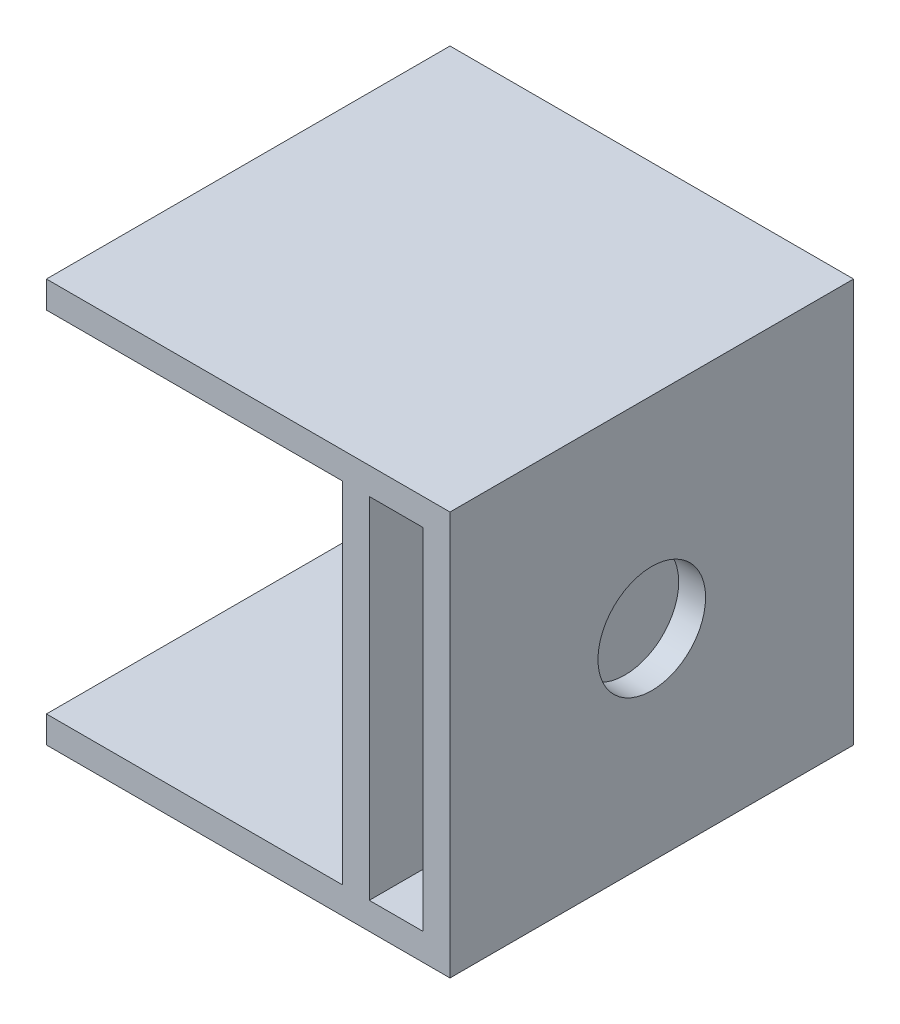
ISO-10303-21;
HEADER;
FILE_DESCRIPTION(('STEP AP214'),'2;1');
FILE_NAME('part.step','',(''),(''),'','','');
FILE_SCHEMA(('AUTOMOTIVE_DESIGN { 1 0 10303 214 1 1 1 1 }'));
ENDSEC;
DATA;
#1=APPLICATION_CONTEXT('core data for automotive mechanical design processes');
#2=APPLICATION_PROTOCOL_DEFINITION('international standard','automotive_design',2000,#1);
#3=PRODUCT_CONTEXT('',#1,'mechanical');
#4=PRODUCT('Part','Part','',(#3));
#5=PRODUCT_RELATED_PRODUCT_CATEGORY('part','',(#4));
#6=PRODUCT_DEFINITION_FORMATION('','',#4);
#7=PRODUCT_DEFINITION_CONTEXT('part definition',#1,'design');
#8=PRODUCT_DEFINITION('design','',#6,#7);
#9=PRODUCT_DEFINITION_SHAPE('','',#8);
#10=(LENGTH_UNIT() NAMED_UNIT(*) SI_UNIT(.MILLI.,.METRE.));
#11=(NAMED_UNIT(*) PLANE_ANGLE_UNIT() SI_UNIT($,.RADIAN.));
#12=(NAMED_UNIT(*) SI_UNIT($,.STERADIAN.) SOLID_ANGLE_UNIT());
#13=UNCERTAINTY_MEASURE_WITH_UNIT(LENGTH_MEASURE(1.E-05),#10,'distance_accuracy_value','');
#14=(GEOMETRIC_REPRESENTATION_CONTEXT(3) GLOBAL_UNCERTAINTY_ASSIGNED_CONTEXT((#13)) GLOBAL_UNIT_ASSIGNED_CONTEXT((#10,
#11,#12)) REPRESENTATION_CONTEXT('',''));
#15=CARTESIAN_POINT('',(0.,0.,0.));
#16=DIRECTION('',(0.,0.,1.));
#17=DIRECTION('',(1.,0.,0.));
#18=AXIS2_PLACEMENT_3D('',#15,#16,#17);
#19=CARTESIAN_POINT('',(0.,0.,30.));
#20=DIRECTION('',(0.,0.,1.));
#21=DIRECTION('',(1.,0.,0.));
#22=AXIS2_PLACEMENT_3D('',#19,#20,#21);
#23=PLANE('',#22);
#24=DIRECTION('',(0.,-1.,0.));
#25=VECTOR('',#24,1.);
#26=CARTESIAN_POINT('',(-17.8612716763006,18.2225433526011,30.));
#27=LINE('',#26,#25);
#28=CARTESIAN_POINT('',(-17.8612716763006,18.2225433526011,30.));
#29=VERTEX_POINT('',#28);
#30=CARTESIAN_POINT('',(-17.8612716763006,16.2225433526011,30.));
#31=VERTEX_POINT('',#30);
#32=EDGE_CURVE('E161',#29,#31,#27,.T.);
#33=ORIENTED_EDGE('',*,*,#32,.T.);
#34=DIRECTION('',(1.,0.,0.));
#35=VECTOR('',#34,1.);
#36=CARTESIAN_POINT('',(-17.8612716763006,16.2225433526011,30.));
#37=LINE('',#36,#35);
#38=CARTESIAN_POINT('',(4.13872832369941,16.2225433526011,30.));
#39=VERTEX_POINT('',#38);
#40=EDGE_CURVE('E164',#31,#39,#37,.T.);
#41=ORIENTED_EDGE('',*,*,#40,.T.);
#42=DIRECTION('',(0.,-1.,0.));
#43=VECTOR('',#42,1.);
#44=CARTESIAN_POINT('',(4.13872832369941,16.2225433526011,30.));
#45=LINE('',#44,#43);
#46=CARTESIAN_POINT('',(4.13872832369941,-9.77745664739885,30.));
#47=VERTEX_POINT('',#46);
#48=EDGE_CURVE('E167',#39,#47,#45,.T.);
#49=ORIENTED_EDGE('',*,*,#48,.T.);
#50=DIRECTION('',(-1.,0.,0.));
#51=VECTOR('',#50,1.);
#52=CARTESIAN_POINT('',(4.13872832369941,-9.77745664739885,30.));
#53=LINE('',#52,#51);
#54=CARTESIAN_POINT('',(-17.8612716763006,-9.77745664739885,30.));
#55=VERTEX_POINT('',#54);
#56=EDGE_CURVE('E169',#47,#55,#53,.T.);
#57=ORIENTED_EDGE('',*,*,#56,.T.);
#58=DIRECTION('',(0.,-1.,0.));
#59=VECTOR('',#58,1.);
#60=CARTESIAN_POINT('',(-17.8612716763006,-9.77745664739885,30.));
#61=LINE('',#60,#59);
#62=CARTESIAN_POINT('',(-17.8612716763006,-11.7774566473989,30.));
#63=VERTEX_POINT('',#62);
#64=EDGE_CURVE('E171',#55,#63,#61,.T.);
#65=ORIENTED_EDGE('',*,*,#64,.T.);
#66=DIRECTION('',(1.,0.,0.));
#67=VECTOR('',#66,1.);
#68=CARTESIAN_POINT('',(12.1387283236994,-11.7774566473989,30.));
#69=LINE('',#68,#67);
#70=CARTESIAN_POINT('',(12.1387283236994,-11.7774566473989,30.));
#71=VERTEX_POINT('',#70);
#72=EDGE_CURVE('E173',#63,#71,#69,.T.);
#73=ORIENTED_EDGE('',*,*,#72,.T.);
#74=DIRECTION('',(0.,1.,0.));
#75=VECTOR('',#74,1.);
#76=CARTESIAN_POINT('',(12.1387283236994,18.2225433526011,30.));
#77=LINE('',#76,#75);
#78=CARTESIAN_POINT('',(12.1387283236994,18.2225433526011,30.));
#79=VERTEX_POINT('',#78);
#80=EDGE_CURVE('E175',#71,#79,#77,.T.);
#81=ORIENTED_EDGE('',*,*,#80,.T.);
#82=DIRECTION('',(-1.,0.,0.));
#83=VECTOR('',#82,1.);
#84=CARTESIAN_POINT('',(-17.8612716763006,18.2225433526011,30.));
#85=LINE('',#84,#83);
#86=EDGE_CURVE('E177',#79,#29,#85,.T.);
#87=ORIENTED_EDGE('',*,*,#86,.T.);
#88=EDGE_LOOP('',(#33,#41,#49,#57,#65,#73,#81,#87));
#89=FACE_BOUND('',#88,.T.);
#90=DIRECTION('',(0.,-1.,0.));
#91=VECTOR('',#90,1.);
#92=CARTESIAN_POINT('',(6.13872832369941,16.2225433526011,30.));
#93=LINE('',#92,#91);
#94=CARTESIAN_POINT('',(6.13872832369941,16.2225433526011,30.));
#95=VERTEX_POINT('',#94);
#96=CARTESIAN_POINT('',(6.13872832369941,-9.77745664739885,30.));
#97=VERTEX_POINT('',#96);
#98=EDGE_CURVE('E131',#95,#97,#93,.T.);
#99=ORIENTED_EDGE('',*,*,#98,.F.);
#100=DIRECTION('',(-1.,0.,0.));
#101=VECTOR('',#100,1.);
#102=CARTESIAN_POINT('',(6.13872832369941,16.2225433526011,30.));
#103=LINE('',#102,#101);
#104=CARTESIAN_POINT('',(10.1387283236994,16.2225433526011,30.));
#105=VERTEX_POINT('',#104);
#106=EDGE_CURVE('E123',#105,#95,#103,.T.);
#107=ORIENTED_EDGE('',*,*,#106,.F.);
#108=DIRECTION('',(0.,1.,0.));
#109=VECTOR('',#108,1.);
#110=CARTESIAN_POINT('',(10.1387283236994,16.2225433526011,30.));
#111=LINE('',#110,#109);
#112=CARTESIAN_POINT('',(10.1387283236994,-9.77745664739885,30.));
#113=VERTEX_POINT('',#112);
#114=EDGE_CURVE('E145',#113,#105,#111,.T.);
#115=ORIENTED_EDGE('',*,*,#114,.F.);
#116=DIRECTION('',(1.,0.,0.));
#117=VECTOR('',#116,1.);
#118=CARTESIAN_POINT('',(10.1387283236994,-9.77745664739885,30.));
#119=LINE('',#118,#117);
#120=EDGE_CURVE('E143',#97,#113,#119,.T.);
#121=ORIENTED_EDGE('',*,*,#120,.F.);
#122=EDGE_LOOP('',(#99,#107,#115,#121));
#123=FACE_BOUND('',#122,.T.);
#124=ADVANCED_FACE('F33',(#89,#123),#23,.T.);
#125=CARTESIAN_POINT('',(0.,0.,0.));
#126=DIRECTION('',(0.,0.,1.));
#127=DIRECTION('',(1.,0.,0.));
#128=AXIS2_PLACEMENT_3D('',#125,#126,#127);
#129=PLANE('',#128);
#130=DIRECTION('',(0.,-1.,0.));
#131=VECTOR('',#130,1.);
#132=CARTESIAN_POINT('',(-17.8612716763006,18.2225433526011,0.));
#133=LINE('',#132,#131);
#134=CARTESIAN_POINT('',(-17.8612716763006,18.2225433526011,0.));
#135=VERTEX_POINT('',#134);
#136=CARTESIAN_POINT('',(-17.8612716763006,16.2225433526011,0.));
#137=VERTEX_POINT('',#136);
#138=EDGE_CURVE('E139',#135,#137,#133,.T.);
#139=ORIENTED_EDGE('',*,*,#138,.F.);
#140=DIRECTION('',(-1.,0.,0.));
#141=VECTOR('',#140,1.);
#142=CARTESIAN_POINT('',(-17.8612716763006,18.2225433526011,0.));
#143=LINE('',#142,#141);
#144=CARTESIAN_POINT('',(12.1387283236994,18.2225433526011,0.));
#145=VERTEX_POINT('',#144);
#146=EDGE_CURVE('E165',#145,#135,#143,.T.);
#147=ORIENTED_EDGE('',*,*,#146,.F.);
#148=DIRECTION('',(0.,1.,0.));
#149=VECTOR('',#148,1.);
#150=CARTESIAN_POINT('',(12.1387283236994,18.2225433526011,0.));
#151=LINE('',#150,#149);
#152=CARTESIAN_POINT('',(12.1387283236994,-11.7774566473989,0.));
#153=VERTEX_POINT('',#152);
#154=EDGE_CURVE('E192',#153,#145,#151,.T.);
#155=ORIENTED_EDGE('',*,*,#154,.F.);
#156=DIRECTION('',(1.,0.,0.));
#157=VECTOR('',#156,1.);
#158=CARTESIAN_POINT('',(12.1387283236994,-11.7774566473989,0.));
#159=LINE('',#158,#157);
#160=CARTESIAN_POINT('',(-17.8612716763006,-11.7774566473989,0.));
#161=VERTEX_POINT('',#160);
#162=EDGE_CURVE('E190',#161,#153,#159,.T.);
#163=ORIENTED_EDGE('',*,*,#162,.F.);
#164=DIRECTION('',(0.,-1.,0.));
#165=VECTOR('',#164,1.);
#166=CARTESIAN_POINT('',(-17.8612716763006,-9.77745664739885,0.));
#167=LINE('',#166,#165);
#168=CARTESIAN_POINT('',(-17.8612716763006,-9.77745664739885,0.));
#169=VERTEX_POINT('',#168);
#170=EDGE_CURVE('E188',#169,#161,#167,.T.);
#171=ORIENTED_EDGE('',*,*,#170,.F.);
#172=DIRECTION('',(-1.,0.,0.));
#173=VECTOR('',#172,1.);
#174=CARTESIAN_POINT('',(4.13872832369941,-9.77745664739885,0.));
#175=LINE('',#174,#173);
#176=CARTESIAN_POINT('',(4.13872832369941,-9.77745664739885,0.));
#177=VERTEX_POINT('',#176);
#178=EDGE_CURVE('E186',#177,#169,#175,.T.);
#179=ORIENTED_EDGE('',*,*,#178,.F.);
#180=DIRECTION('',(0.,-1.,0.));
#181=VECTOR('',#180,1.);
#182=CARTESIAN_POINT('',(4.13872832369941,16.2225433526011,0.));
#183=LINE('',#182,#181);
#184=CARTESIAN_POINT('',(4.13872832369941,16.2225433526011,0.));
#185=VERTEX_POINT('',#184);
#186=EDGE_CURVE('E184',#185,#177,#183,.T.);
#187=ORIENTED_EDGE('',*,*,#186,.F.);
#188=DIRECTION('',(1.,0.,0.));
#189=VECTOR('',#188,1.);
#190=CARTESIAN_POINT('',(-17.8612716763006,16.2225433526011,0.));
#191=LINE('',#190,#189);
#192=EDGE_CURVE('E182',#137,#185,#191,.T.);
#193=ORIENTED_EDGE('',*,*,#192,.F.);
#194=EDGE_LOOP('',(#139,#147,#155,#163,#171,#179,#187,#193));
#195=FACE_BOUND('',#194,.T.);
#196=DIRECTION('',(-1.,0.,0.));
#197=VECTOR('',#196,1.);
#198=CARTESIAN_POINT('',(6.13872832369941,16.2225433526011,0.));
#199=LINE('',#198,#197);
#200=CARTESIAN_POINT('',(10.1387283236994,16.2225433526011,0.));
#201=VERTEX_POINT('',#200);
#202=CARTESIAN_POINT('',(6.13872832369941,16.2225433526011,0.));
#203=VERTEX_POINT('',#202);
#204=EDGE_CURVE('E57',#201,#203,#199,.T.);
#205=ORIENTED_EDGE('',*,*,#204,.T.);
#206=DIRECTION('',(0.,-1.,0.));
#207=VECTOR('',#206,1.);
#208=CARTESIAN_POINT('',(6.13872832369941,16.2225433526011,0.));
#209=LINE('',#208,#207);
#210=CARTESIAN_POINT('',(6.13872832369941,-9.77745664739885,0.));
#211=VERTEX_POINT('',#210);
#212=EDGE_CURVE('E138',#203,#211,#209,.T.);
#213=ORIENTED_EDGE('',*,*,#212,.T.);
#214=DIRECTION('',(1.,0.,0.));
#215=VECTOR('',#214,1.);
#216=CARTESIAN_POINT('',(10.1387283236994,-9.77745664739885,0.));
#217=LINE('',#216,#215);
#218=CARTESIAN_POINT('',(10.1387283236994,-9.77745664739885,0.));
#219=VERTEX_POINT('',#218);
#220=EDGE_CURVE('E153',#211,#219,#217,.T.);
#221=ORIENTED_EDGE('',*,*,#220,.T.);
#222=DIRECTION('',(0.,1.,0.));
#223=VECTOR('',#222,1.);
#224=CARTESIAN_POINT('',(10.1387283236994,16.2225433526011,0.));
#225=LINE('',#224,#223);
#226=EDGE_CURVE('E132',#219,#201,#225,.T.);
#227=ORIENTED_EDGE('',*,*,#226,.T.);
#228=EDGE_LOOP('',(#205,#213,#221,#227));
#229=FACE_BOUND('',#228,.T.);
#230=ADVANCED_FACE('F223',(#195,#229),#129,.F.);
#231=CARTESIAN_POINT('',(-17.8612716763006,18.2225433526011,30.));
#232=DIRECTION('',(1.,0.,0.));
#233=DIRECTION('',(0.,0.,-1.));
#234=AXIS2_PLACEMENT_3D('',#231,#232,#233);
#235=PLANE('',#234);
#236=ORIENTED_EDGE('',*,*,#138,.T.);
#237=DIRECTION('',(0.,0.,-1.));
#238=VECTOR('',#237,1.);
#239=CARTESIAN_POINT('',(-17.8612716763006,16.2225433526011,30.));
#240=LINE('',#239,#238);
#241=EDGE_CURVE('E11',#31,#137,#240,.T.);
#242=ORIENTED_EDGE('',*,*,#241,.F.);
#243=ORIENTED_EDGE('',*,*,#32,.F.);
#244=DIRECTION('',(0.,0.,-1.));
#245=VECTOR('',#244,1.);
#246=CARTESIAN_POINT('',(-17.8612716763006,18.2225433526011,30.));
#247=LINE('',#246,#245);
#248=EDGE_CURVE('E179',#29,#135,#247,.T.);
#249=ORIENTED_EDGE('',*,*,#248,.T.);
#250=EDGE_LOOP('',(#236,#242,#243,#249));
#251=FACE_BOUND('',#250,.T.);
#252=ADVANCED_FACE('F35',(#251),#235,.F.);
#253=CARTESIAN_POINT('',(-17.8612716763006,16.2225433526011,30.));
#254=DIRECTION('',(0.,1.,0.));
#255=DIRECTION('',(0.,0.,1.));
#256=AXIS2_PLACEMENT_3D('',#253,#254,#255);
#257=PLANE('',#256);
#258=ORIENTED_EDGE('',*,*,#192,.T.);
#259=DIRECTION('',(0.,0.,-1.));
#260=VECTOR('',#259,1.);
#261=CARTESIAN_POINT('',(4.13872832369941,16.2225433526011,30.));
#262=LINE('',#261,#260);
#263=EDGE_CURVE('E42',#39,#185,#262,.T.);
#264=ORIENTED_EDGE('',*,*,#263,.F.);
#265=ORIENTED_EDGE('',*,*,#40,.F.);
#266=ORIENTED_EDGE('',*,*,#241,.T.);
#267=EDGE_LOOP('',(#258,#264,#265,#266));
#268=FACE_BOUND('',#267,.T.);
#269=ADVANCED_FACE('F240',(#268),#257,.F.);
#270=CARTESIAN_POINT('',(4.13872832369941,16.2225433526011,30.));
#271=DIRECTION('',(1.,0.,0.));
#272=DIRECTION('',(0.,1.,0.));
#273=AXIS2_PLACEMENT_3D('',#270,#271,#272);
#274=PLANE('',#273);
#275=CARTESIAN_POINT('',(4.13872832369941,3.22254335260115,15.));
#276=DIRECTION('',(1.,0.,0.));
#277=DIRECTION('',(0.,1.,0.));
#278=AXIS2_PLACEMENT_3D('',#275,#276,#277);
#279=CIRCLE('',#278,4.);
#280=CARTESIAN_POINT('',(4.13872832369941,7.22254335260115,15.));
#281=VERTEX_POINT('',#280);
#282=EDGE_CURVE('E151',#281,#281,#279,.T.);
#283=ORIENTED_EDGE('',*,*,#282,.T.);
#284=EDGE_LOOP('',(#283));
#285=FACE_BOUND('',#284,.T.);
#286=ORIENTED_EDGE('',*,*,#186,.T.);
#287=DIRECTION('',(0.,0.,-1.));
#288=VECTOR('',#287,1.);
#289=CARTESIAN_POINT('',(4.13872832369941,-9.77745664739885,30.));
#290=LINE('',#289,#288);
#291=EDGE_CURVE('E209',#47,#177,#290,.T.);
#292=ORIENTED_EDGE('',*,*,#291,.F.);
#293=ORIENTED_EDGE('',*,*,#48,.F.);
#294=ORIENTED_EDGE('',*,*,#263,.T.);
#295=EDGE_LOOP('',(#286,#292,#293,#294));
#296=FACE_BOUND('',#295,.T.);
#297=ADVANCED_FACE('F217',(#285,#296),#274,.F.);
#298=CARTESIAN_POINT('',(4.13872832369941,-9.77745664739885,30.));
#299=DIRECTION('',(0.,-1.,0.));
#300=DIRECTION('',(1.,0.,0.));
#301=AXIS2_PLACEMENT_3D('',#298,#299,#300);
#302=PLANE('',#301);
#303=ORIENTED_EDGE('',*,*,#178,.T.);
#304=DIRECTION('',(0.,0.,-1.));
#305=VECTOR('',#304,1.);
#306=CARTESIAN_POINT('',(-17.8612716763006,-9.77745664739885,30.));
#307=LINE('',#306,#305);
#308=EDGE_CURVE('E206',#55,#169,#307,.T.);
#309=ORIENTED_EDGE('',*,*,#308,.F.);
#310=ORIENTED_EDGE('',*,*,#56,.F.);
#311=ORIENTED_EDGE('',*,*,#291,.T.);
#312=EDGE_LOOP('',(#303,#309,#310,#311));
#313=FACE_BOUND('',#312,.T.);
#314=ADVANCED_FACE('F229',(#313),#302,.F.);
#315=CARTESIAN_POINT('',(-17.8612716763006,-9.77745664739885,30.));
#316=DIRECTION('',(1.,0.,0.));
#317=DIRECTION('',(0.,0.,-1.));
#318=AXIS2_PLACEMENT_3D('',#315,#316,#317);
#319=PLANE('',#318);
#320=ORIENTED_EDGE('',*,*,#170,.T.);
#321=DIRECTION('',(0.,0.,-1.));
#322=VECTOR('',#321,1.);
#323=CARTESIAN_POINT('',(-17.8612716763006,-11.7774566473989,30.));
#324=LINE('',#323,#322);
#325=EDGE_CURVE('E203',#63,#161,#324,.T.);
#326=ORIENTED_EDGE('',*,*,#325,.F.);
#327=ORIENTED_EDGE('',*,*,#64,.F.);
#328=ORIENTED_EDGE('',*,*,#308,.T.);
#329=EDGE_LOOP('',(#320,#326,#327,#328));
#330=FACE_BOUND('',#329,.T.);
#331=ADVANCED_FACE('F233',(#330),#319,.F.);
#332=CARTESIAN_POINT('',(12.1387283236994,-11.7774566473989,30.));
#333=DIRECTION('',(0.,1.,0.));
#334=DIRECTION('',(0.,0.,1.));
#335=AXIS2_PLACEMENT_3D('',#332,#333,#334);
#336=PLANE('',#335);
#337=ORIENTED_EDGE('',*,*,#162,.T.);
#338=DIRECTION('',(0.,0.,-1.));
#339=VECTOR('',#338,1.);
#340=CARTESIAN_POINT('',(12.1387283236994,-11.7774566473989,30.));
#341=LINE('',#340,#339);
#342=EDGE_CURVE('E200',#71,#153,#341,.T.);
#343=ORIENTED_EDGE('',*,*,#342,.F.);
#344=ORIENTED_EDGE('',*,*,#72,.F.);
#345=ORIENTED_EDGE('',*,*,#325,.T.);
#346=EDGE_LOOP('',(#337,#343,#344,#345));
#347=FACE_BOUND('',#346,.T.);
#348=ADVANCED_FACE('F253',(#347),#336,.F.);
#349=CARTESIAN_POINT('',(12.1387283236994,18.2225433526011,30.));
#350=DIRECTION('',(-1.,0.,0.));
#351=DIRECTION('',(0.,0.,1.));
#352=AXIS2_PLACEMENT_3D('',#349,#350,#351);
#353=PLANE('',#352);
#354=CARTESIAN_POINT('',(12.1387283236994,3.22254335260115,15.));
#355=DIRECTION('',(1.,0.,0.));
#356=DIRECTION('',(0.,0.,-1.));
#357=AXIS2_PLACEMENT_3D('',#354,#355,#356);
#358=CIRCLE('',#357,4.);
#359=CARTESIAN_POINT('',(12.1387283236994,3.22254335260115,11.));
#360=VERTEX_POINT('',#359);
#361=EDGE_CURVE('E305',#360,#360,#358,.T.);
#362=ORIENTED_EDGE('',*,*,#361,.F.);
#363=EDGE_LOOP('',(#362));
#364=FACE_BOUND('',#363,.T.);
#365=ORIENTED_EDGE('',*,*,#154,.T.);
#366=DIRECTION('',(0.,0.,-1.));
#367=VECTOR('',#366,1.);
#368=CARTESIAN_POINT('',(12.1387283236994,18.2225433526011,30.));
#369=LINE('',#368,#367);
#370=EDGE_CURVE('E197',#79,#145,#369,.T.);
#371=ORIENTED_EDGE('',*,*,#370,.F.);
#372=ORIENTED_EDGE('',*,*,#80,.F.);
#373=ORIENTED_EDGE('',*,*,#342,.T.);
#374=EDGE_LOOP('',(#365,#371,#372,#373));
#375=FACE_BOUND('',#374,.T.);
#376=ADVANCED_FACE('F251',(#364,#375),#353,.F.);
#377=CARTESIAN_POINT('',(-17.8612716763006,18.2225433526011,30.));
#378=DIRECTION('',(0.,-1.,0.));
#379=DIRECTION('',(0.,0.,-1.));
#380=AXIS2_PLACEMENT_3D('',#377,#378,#379);
#381=PLANE('',#380);
#382=ORIENTED_EDGE('',*,*,#146,.T.);
#383=ORIENTED_EDGE('',*,*,#248,.F.);
#384=ORIENTED_EDGE('',*,*,#86,.F.);
#385=ORIENTED_EDGE('',*,*,#370,.T.);
#386=EDGE_LOOP('',(#382,#383,#384,#385));
#387=FACE_BOUND('',#386,.T.);
#388=ADVANCED_FACE('F246',(#387),#381,.F.);
#389=CARTESIAN_POINT('',(6.13872832369941,16.2225433526011,30.));
#390=DIRECTION('',(0.,-1.,0.));
#391=DIRECTION('',(0.,0.,-1.));
#392=AXIS2_PLACEMENT_3D('',#389,#390,#391);
#393=PLANE('',#392);
#394=ORIENTED_EDGE('',*,*,#204,.F.);
#395=DIRECTION('',(0.,0.,-1.));
#396=VECTOR('',#395,1.);
#397=CARTESIAN_POINT('',(10.1387283236994,16.2225433526011,30.));
#398=LINE('',#397,#396);
#399=EDGE_CURVE('E127',#105,#201,#398,.T.);
#400=ORIENTED_EDGE('',*,*,#399,.F.);
#401=ORIENTED_EDGE('',*,*,#106,.T.);
#402=DIRECTION('',(0.,0.,-1.));
#403=VECTOR('',#402,1.);
#404=CARTESIAN_POINT('',(6.13872832369941,16.2225433526011,30.));
#405=LINE('',#404,#403);
#406=EDGE_CURVE('E126',#95,#203,#405,.T.);
#407=ORIENTED_EDGE('',*,*,#406,.T.);
#408=EDGE_LOOP('',(#394,#400,#401,#407));
#409=FACE_BOUND('',#408,.T.);
#410=ADVANCED_FACE('F125',(#409),#393,.T.);
#411=CARTESIAN_POINT('',(6.13872832369941,16.2225433526011,30.));
#412=DIRECTION('',(1.,0.,0.));
#413=DIRECTION('',(0.,1.,0.));
#414=AXIS2_PLACEMENT_3D('',#411,#412,#413);
#415=PLANE('',#414);
#416=CARTESIAN_POINT('',(6.13872832369941,3.22254335260115,15.));
#417=DIRECTION('',(1.,0.,0.));
#418=DIRECTION('',(0.,1.,0.));
#419=AXIS2_PLACEMENT_3D('',#416,#417,#418);
#420=CIRCLE('',#419,4.);
#421=CARTESIAN_POINT('',(6.13872832369941,7.22254335260115,15.));
#422=VERTEX_POINT('',#421);
#423=EDGE_CURVE('E307',#422,#422,#420,.T.);
#424=ORIENTED_EDGE('',*,*,#423,.F.);
#425=EDGE_LOOP('',(#424));
#426=FACE_BOUND('',#425,.T.);
#427=ORIENTED_EDGE('',*,*,#212,.F.);
#428=ORIENTED_EDGE('',*,*,#406,.F.);
#429=ORIENTED_EDGE('',*,*,#98,.T.);
#430=DIRECTION('',(0.,0.,-1.));
#431=VECTOR('',#430,1.);
#432=CARTESIAN_POINT('',(6.13872832369941,-9.77745664739885,30.));
#433=LINE('',#432,#431);
#434=EDGE_CURVE('E140',#97,#211,#433,.T.);
#435=ORIENTED_EDGE('',*,*,#434,.T.);
#436=EDGE_LOOP('',(#427,#428,#429,#435));
#437=FACE_BOUND('',#436,.T.);
#438=ADVANCED_FACE('F135',(#426,#437),#415,.T.);
#439=CARTESIAN_POINT('',(10.1387283236994,-9.77745664739885,30.));
#440=DIRECTION('',(0.,1.,0.));
#441=DIRECTION('',(0.,0.,1.));
#442=AXIS2_PLACEMENT_3D('',#439,#440,#441);
#443=PLANE('',#442);
#444=ORIENTED_EDGE('',*,*,#220,.F.);
#445=ORIENTED_EDGE('',*,*,#434,.F.);
#446=ORIENTED_EDGE('',*,*,#120,.T.);
#447=DIRECTION('',(0.,0.,-1.));
#448=VECTOR('',#447,1.);
#449=CARTESIAN_POINT('',(10.1387283236994,-9.77745664739885,30.));
#450=LINE('',#449,#448);
#451=EDGE_CURVE('E49',#113,#219,#450,.T.);
#452=ORIENTED_EDGE('',*,*,#451,.T.);
#453=EDGE_LOOP('',(#444,#445,#446,#452));
#454=FACE_BOUND('',#453,.T.);
#455=ADVANCED_FACE('F279',(#454),#443,.T.);
#456=CARTESIAN_POINT('',(10.1387283236994,16.2225433526011,30.));
#457=DIRECTION('',(-1.,0.,0.));
#458=DIRECTION('',(0.,-1.,0.));
#459=AXIS2_PLACEMENT_3D('',#456,#457,#458);
#460=PLANE('',#459);
#461=CARTESIAN_POINT('',(10.1387283236994,3.22254335260115,15.));
#462=DIRECTION('',(-1.,0.,0.));
#463=DIRECTION('',(0.,-1.,0.));
#464=AXIS2_PLACEMENT_3D('',#461,#462,#463);
#465=CIRCLE('',#464,4.);
#466=CARTESIAN_POINT('',(10.1387283236994,-0.777456647398852,15.));
#467=VERTEX_POINT('',#466);
#468=EDGE_CURVE('E37',#467,#467,#465,.T.);
#469=ORIENTED_EDGE('',*,*,#468,.F.);
#470=EDGE_LOOP('',(#469));
#471=FACE_BOUND('',#470,.T.);
#472=ORIENTED_EDGE('',*,*,#226,.F.);
#473=ORIENTED_EDGE('',*,*,#451,.F.);
#474=ORIENTED_EDGE('',*,*,#114,.T.);
#475=ORIENTED_EDGE('',*,*,#399,.T.);
#476=EDGE_LOOP('',(#472,#473,#474,#475));
#477=FACE_BOUND('',#476,.T.);
#478=ADVANCED_FACE('F284',(#471,#477),#460,.T.);
#479=CARTESIAN_POINT('',(-17.8612716763006,3.22254335260115,15.));
#480=DIRECTION('',(1.,0.,0.));
#481=DIRECTION('',(0.,0.,-1.));
#482=AXIS2_PLACEMENT_3D('',#479,#480,#481);
#483=CYLINDRICAL_SURFACE('',#482,4.);
#484=ORIENTED_EDGE('',*,*,#468,.T.);
#485=EDGE_LOOP('',(#484));
#486=FACE_BOUND('',#485,.T.);
#487=ORIENTED_EDGE('',*,*,#361,.T.);
#488=EDGE_LOOP('',(#487));
#489=FACE_BOUND('',#488,.T.);
#490=ADVANCED_FACE('F291',(#486,#489),#483,.F.);
#491=ORIENTED_EDGE('',*,*,#423,.T.);
#492=EDGE_LOOP('',(#491));
#493=FACE_BOUND('',#492,.T.);
#494=ORIENTED_EDGE('',*,*,#282,.F.);
#495=EDGE_LOOP('',(#494));
#496=FACE_BOUND('',#495,.T.);
#497=ADVANCED_FACE('F294',(#493,#496),#483,.F.);
#498=CLOSED_SHELL('',(#124,#230,#252,#269,#297,#314,#331,#348,#376,#388,#410,#438,#455,#478,
#490,#497));
#499=MANIFOLD_SOLID_BREP('B2',#498);
#500=ADVANCED_BREP_SHAPE_REPRESENTATION('',(#18,#499),#14);
#501=SHAPE_DEFINITION_REPRESENTATION(#9,#500);
ENDSEC;
END-ISO-10303-21;
